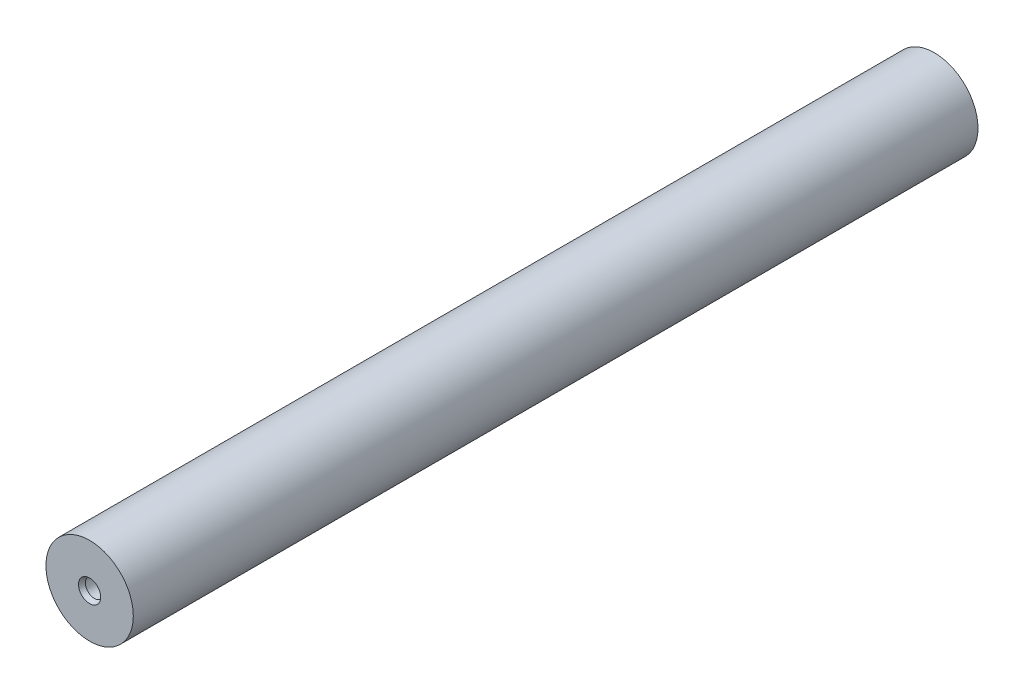
ISO-10303-21;
HEADER;
FILE_DESCRIPTION(('STEP AP214'),'2;1');
FILE_NAME('part.step','',(''),(''),'','','');
FILE_SCHEMA(('AUTOMOTIVE_DESIGN { 1 0 10303 214 1 1 1 1 }'));
ENDSEC;
DATA;
#1=APPLICATION_CONTEXT('core data for automotive mechanical design processes');
#2=APPLICATION_PROTOCOL_DEFINITION('international standard','automotive_design',2000,#1);
#3=PRODUCT_CONTEXT('',#1,'mechanical');
#4=PRODUCT('Part','Part','',(#3));
#5=PRODUCT_RELATED_PRODUCT_CATEGORY('part','',(#4));
#6=PRODUCT_DEFINITION_FORMATION('','',#4);
#7=PRODUCT_DEFINITION_CONTEXT('part definition',#1,'design');
#8=PRODUCT_DEFINITION('design','',#6,#7);
#9=PRODUCT_DEFINITION_SHAPE('','',#8);
#10=(LENGTH_UNIT() NAMED_UNIT(*) SI_UNIT(.MILLI.,.METRE.));
#11=(NAMED_UNIT(*) PLANE_ANGLE_UNIT() SI_UNIT($,.RADIAN.));
#12=(NAMED_UNIT(*) SI_UNIT($,.STERADIAN.) SOLID_ANGLE_UNIT());
#13=UNCERTAINTY_MEASURE_WITH_UNIT(LENGTH_MEASURE(1.E-05),#10,'distance_accuracy_value','');
#14=(GEOMETRIC_REPRESENTATION_CONTEXT(3) GLOBAL_UNCERTAINTY_ASSIGNED_CONTEXT((#13)) GLOBAL_UNIT_ASSIGNED_CONTEXT((#10,
#11,#12)) REPRESENTATION_CONTEXT('',''));
#15=CARTESIAN_POINT('',(0.,0.,0.));
#16=DIRECTION('',(0.,0.,1.));
#17=DIRECTION('',(1.,0.,0.));
#18=AXIS2_PLACEMENT_3D('',#15,#16,#17);
#19=CARTESIAN_POINT('',(0.,0.,116.));
#20=DIRECTION('',(0.,0.,-1.));
#21=DIRECTION('',(-1.,0.,0.));
#22=AXIS2_PLACEMENT_3D('',#19,#20,#21);
#23=CYLINDRICAL_SURFACE('',#22,6.);
#24=CARTESIAN_POINT('',(0.,0.,116.));
#25=DIRECTION('',(0.,0.,1.));
#26=DIRECTION('',(1.,0.,0.));
#27=AXIS2_PLACEMENT_3D('',#24,#25,#26);
#28=CIRCLE('',#27,6.);
#29=CARTESIAN_POINT('',(6.,0.,116.));
#30=VERTEX_POINT('',#29);
#31=EDGE_CURVE('E11',#30,#30,#28,.T.);
#32=ORIENTED_EDGE('',*,*,#31,.F.);
#33=EDGE_LOOP('',(#32));
#34=FACE_BOUND('',#33,.T.);
#35=CARTESIAN_POINT('',(0.,0.,0.));
#36=DIRECTION('',(0.,0.,1.));
#37=DIRECTION('',(1.,0.,0.));
#38=AXIS2_PLACEMENT_3D('',#35,#36,#37);
#39=CIRCLE('',#38,6.);
#40=CARTESIAN_POINT('',(6.,0.,0.));
#41=VERTEX_POINT('',#40);
#42=EDGE_CURVE('E39',#41,#41,#39,.T.);
#43=ORIENTED_EDGE('',*,*,#42,.T.);
#44=EDGE_LOOP('',(#43));
#45=FACE_BOUND('',#44,.T.);
#46=ADVANCED_FACE('F36',(#34,#45),#23,.T.);
#47=CARTESIAN_POINT('',(0.,0.,116.));
#48=DIRECTION('',(0.,0.,1.));
#49=DIRECTION('',(1.,0.,0.));
#50=AXIS2_PLACEMENT_3D('',#47,#48,#49);
#51=PLANE('',#50);
#52=CARTESIAN_POINT('',(0.,0.,116.));
#53=DIRECTION('',(0.,0.,1.));
#54=DIRECTION('',(1.,0.,0.));
#55=AXIS2_PLACEMENT_3D('',#52,#53,#54);
#56=CIRCLE('',#55,1.525);
#57=CARTESIAN_POINT('',(1.525,0.,116.));
#58=VERTEX_POINT('',#57);
#59=EDGE_CURVE('E59',#58,#58,#56,.T.);
#60=ORIENTED_EDGE('',*,*,#59,.F.);
#61=EDGE_LOOP('',(#60));
#62=FACE_BOUND('',#61,.T.);
#63=ORIENTED_EDGE('',*,*,#31,.T.);
#64=EDGE_LOOP('',(#63));
#65=FACE_BOUND('',#64,.T.);
#66=ADVANCED_FACE('F83',(#62,#65),#51,.T.);
#67=CARTESIAN_POINT('',(0.,0.,0.));
#68=DIRECTION('',(0.,0.,1.));
#69=DIRECTION('',(1.,0.,0.));
#70=AXIS2_PLACEMENT_3D('',#67,#68,#69);
#71=PLANE('',#70);
#72=CARTESIAN_POINT('',(0.,0.,0.));
#73=DIRECTION('',(0.,0.,-1.));
#74=DIRECTION('',(-1.,0.,0.));
#75=AXIS2_PLACEMENT_3D('',#72,#73,#74);
#76=CIRCLE('',#75,1.525);
#77=CARTESIAN_POINT('',(-1.525,0.,0.));
#78=VERTEX_POINT('',#77);
#79=EDGE_CURVE('E66',#78,#78,#76,.T.);
#80=ORIENTED_EDGE('',*,*,#79,.F.);
#81=EDGE_LOOP('',(#80));
#82=FACE_BOUND('',#81,.T.);
#83=ORIENTED_EDGE('',*,*,#42,.F.);
#84=EDGE_LOOP('',(#83));
#85=FACE_BOUND('',#84,.T.);
#86=ADVANCED_FACE('F80',(#82,#85),#71,.F.);
#87=CARTESIAN_POINT('',(0.,0.,109.251075773784));
#88=DIRECTION('',(0.,0.,1.));
#89=DIRECTION('',(1.,0.,0.));
#90=AXIS2_PLACEMENT_3D('',#87,#88,#89);
#91=CONICAL_SURFACE('',#90,1.25,1.02974425867665);
#92=CARTESIAN_POINT('',(0.,0.,108.5));
#93=VERTEX_POINT('',#92);
#94=VERTEX_LOOP('',#93);
#95=FACE_BOUND('',#94,.T.);
#96=CARTESIAN_POINT('',(0.,0.,109.251075773784));
#97=DIRECTION('',(0.,0.,1.));
#98=DIRECTION('',(1.,0.,0.));
#99=AXIS2_PLACEMENT_3D('',#96,#97,#98);
#100=CIRCLE('',#99,1.25);
#101=CARTESIAN_POINT('',(1.25,0.,109.251075773784));
#102=VERTEX_POINT('',#101);
#103=EDGE_CURVE('E72',#102,#102,#100,.T.);
#104=ORIENTED_EDGE('',*,*,#103,.T.);
#105=EDGE_LOOP('',(#104));
#106=FACE_BOUND('',#105,.T.);
#107=ADVANCED_FACE('F82',(#95,#106),#91,.F.);
#108=CARTESIAN_POINT('',(0.,0.,116.));
#109=DIRECTION('',(0.,0.,1.));
#110=DIRECTION('',(1.,0.,0.));
#111=AXIS2_PLACEMENT_3D('',#108,#109,#110);
#112=CYLINDRICAL_SURFACE('',#111,1.24999999999999);
#113=ORIENTED_EDGE('',*,*,#103,.F.);
#114=EDGE_LOOP('',(#113));
#115=FACE_BOUND('',#114,.T.);
#116=CARTESIAN_POINT('',(0.,0.,115.336091270347));
#117=DIRECTION('',(0.,0.,1.));
#118=DIRECTION('',(1.,0.,0.));
#119=AXIS2_PLACEMENT_3D('',#116,#117,#118);
#120=CIRCLE('',#119,1.24999999999999);
#121=CARTESIAN_POINT('',(1.24999999999999,0.,115.336091270347));
#122=VERTEX_POINT('',#121);
#123=EDGE_CURVE('E63',#122,#122,#120,.T.);
#124=ORIENTED_EDGE('',*,*,#123,.T.);
#125=EDGE_LOOP('',(#124));
#126=FACE_BOUND('',#125,.T.);
#127=ADVANCED_FACE('F89',(#115,#126),#112,.F.);
#128=CARTESIAN_POINT('',(0.,0.,116.));
#129=DIRECTION('',(0.,0.,1.));
#130=DIRECTION('',(1.,0.,0.));
#131=AXIS2_PLACEMENT_3D('',#128,#129,#130);
#132=CONICAL_SURFACE('',#131,1.525,0.392699081698713);
#133=ORIENTED_EDGE('',*,*,#123,.F.);
#134=EDGE_LOOP('',(#133));
#135=FACE_BOUND('',#134,.T.);
#136=ORIENTED_EDGE('',*,*,#59,.T.);
#137=EDGE_LOOP('',(#136));
#138=FACE_BOUND('',#137,.T.);
#139=ADVANCED_FACE('F53',(#135,#138),#132,.F.);
#140=CARTESIAN_POINT('',(0.,0.,6.74892422621555));
#141=DIRECTION('',(0.,0.,-1.));
#142=DIRECTION('',(-1.,0.,0.));
#143=AXIS2_PLACEMENT_3D('',#140,#141,#142);
#144=CONICAL_SURFACE('',#143,1.25,1.02974425867665);
#145=CARTESIAN_POINT('',(0.,0.,7.5));
#146=VERTEX_POINT('',#145);
#147=VERTEX_LOOP('',#146);
#148=FACE_BOUND('',#147,.T.);
#149=CARTESIAN_POINT('',(0.,0.,6.74892422621555));
#150=DIRECTION('',(0.,0.,-1.));
#151=DIRECTION('',(-1.,0.,0.));
#152=AXIS2_PLACEMENT_3D('',#149,#150,#151);
#153=CIRCLE('',#152,1.25);
#154=CARTESIAN_POINT('',(-1.25,0.,6.74892422621555));
#155=VERTEX_POINT('',#154);
#156=EDGE_CURVE('E57',#155,#155,#153,.T.);
#157=ORIENTED_EDGE('',*,*,#156,.T.);
#158=EDGE_LOOP('',(#157));
#159=FACE_BOUND('',#158,.T.);
#160=ADVANCED_FACE('F49',(#148,#159),#144,.F.);
#161=CARTESIAN_POINT('',(0.,0.,0.));
#162=DIRECTION('',(0.,0.,-1.));
#163=DIRECTION('',(-1.,0.,0.));
#164=AXIS2_PLACEMENT_3D('',#161,#162,#163);
#165=CYLINDRICAL_SURFACE('',#164,1.24999999999999);
#166=ORIENTED_EDGE('',*,*,#156,.F.);
#167=EDGE_LOOP('',(#166));
#168=FACE_BOUND('',#167,.T.);
#169=CARTESIAN_POINT('',(0.,0.,0.663908729652649));
#170=DIRECTION('',(0.,0.,-1.));
#171=DIRECTION('',(-1.,0.,0.));
#172=AXIS2_PLACEMENT_3D('',#169,#170,#171);
#173=CIRCLE('',#172,1.24999999999999);
#174=CARTESIAN_POINT('',(-1.24999999999999,0.,0.663908729652649));
#175=VERTEX_POINT('',#174);
#176=EDGE_CURVE('E60',#175,#175,#173,.T.);
#177=ORIENTED_EDGE('',*,*,#176,.T.);
#178=EDGE_LOOP('',(#177));
#179=FACE_BOUND('',#178,.T.);
#180=ADVANCED_FACE('F52',(#168,#179),#165,.F.);
#181=CARTESIAN_POINT('',(0.,0.,0.));
#182=DIRECTION('',(0.,0.,-1.));
#183=DIRECTION('',(-1.,0.,0.));
#184=AXIS2_PLACEMENT_3D('',#181,#182,#183);
#185=CONICAL_SURFACE('',#184,1.525,0.392699081698713);
#186=ORIENTED_EDGE('',*,*,#176,.F.);
#187=EDGE_LOOP('',(#186));
#188=FACE_BOUND('',#187,.T.);
#189=ORIENTED_EDGE('',*,*,#79,.T.);
#190=EDGE_LOOP('',(#189));
#191=FACE_BOUND('',#190,.T.);
#192=ADVANCED_FACE('F147',(#188,#191),#185,.F.);
#193=CLOSED_SHELL('',(#46,#66,#86,#107,#127,#139,#160,#180,#192));
#194=MANIFOLD_SOLID_BREP('B2',#193);
#195=ADVANCED_BREP_SHAPE_REPRESENTATION('',(#18,#194),#14);
#196=SHAPE_DEFINITION_REPRESENTATION(#9,#195);
ENDSEC;
END-ISO-10303-21;
